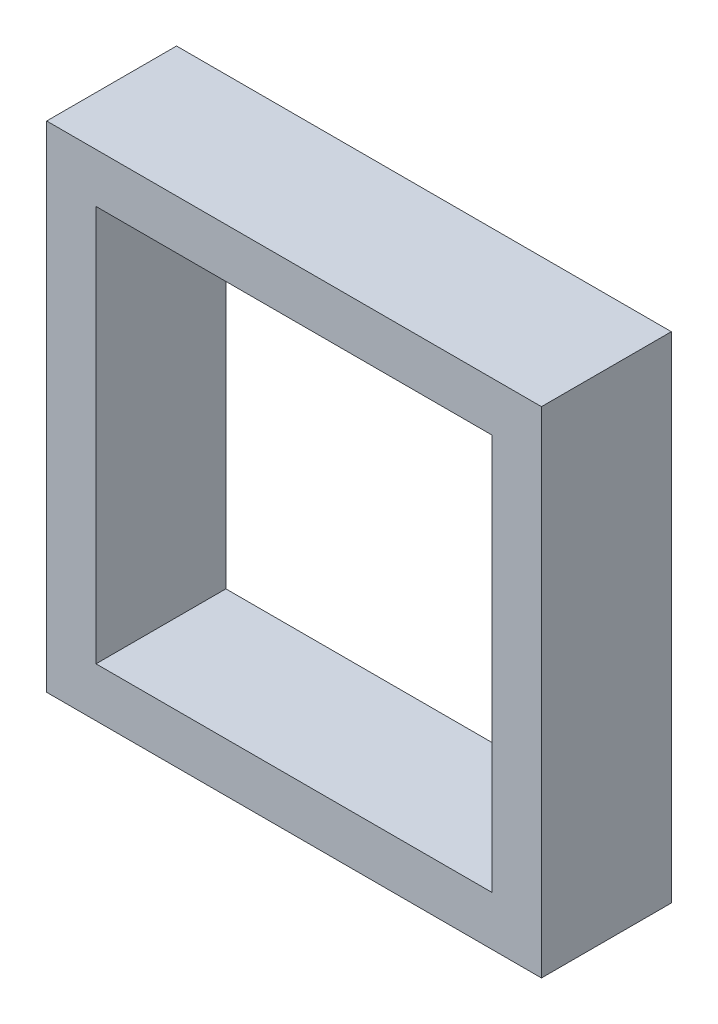
ISO-10303-21;
HEADER;
FILE_DESCRIPTION(('STEP AP214'),'2;1');
FILE_NAME('part.step','',(''),(''),'','','');
FILE_SCHEMA(('AUTOMOTIVE_DESIGN { 1 0 10303 214 1 1 1 1 }'));
ENDSEC;
DATA;
#1=APPLICATION_CONTEXT('core data for automotive mechanical design processes');
#2=APPLICATION_PROTOCOL_DEFINITION('international standard','automotive_design',2000,#1);
#3=PRODUCT_CONTEXT('',#1,'mechanical');
#4=PRODUCT('Part','Part','',(#3));
#5=PRODUCT_RELATED_PRODUCT_CATEGORY('part','',(#4));
#6=PRODUCT_DEFINITION_FORMATION('','',#4);
#7=PRODUCT_DEFINITION_CONTEXT('part definition',#1,'design');
#8=PRODUCT_DEFINITION('design','',#6,#7);
#9=PRODUCT_DEFINITION_SHAPE('','',#8);
#10=(LENGTH_UNIT() NAMED_UNIT(*) SI_UNIT(.MILLI.,.METRE.));
#11=(NAMED_UNIT(*) PLANE_ANGLE_UNIT() SI_UNIT($,.RADIAN.));
#12=(NAMED_UNIT(*) SI_UNIT($,.STERADIAN.) SOLID_ANGLE_UNIT());
#13=UNCERTAINTY_MEASURE_WITH_UNIT(LENGTH_MEASURE(1.E-05),#10,'distance_accuracy_value','');
#14=(GEOMETRIC_REPRESENTATION_CONTEXT(3) GLOBAL_UNCERTAINTY_ASSIGNED_CONTEXT((#13)) GLOBAL_UNIT_ASSIGNED_CONTEXT((#10,
#11,#12)) REPRESENTATION_CONTEXT('',''));
#15=CARTESIAN_POINT('',(0.,0.,0.));
#16=DIRECTION('',(0.,0.,1.));
#17=DIRECTION('',(1.,0.,0.));
#18=AXIS2_PLACEMENT_3D('',#15,#16,#17);
#19=CARTESIAN_POINT('',(0.,0.,10.));
#20=DIRECTION('',(0.,0.,-1.));
#21=DIRECTION('',(-1.,0.,0.));
#22=AXIS2_PLACEMENT_3D('',#19,#20,#21);
#23=PLANE('',#22);
#24=DIRECTION('',(0.,1.,0.));
#25=VECTOR('',#24,1.);
#26=CARTESIAN_POINT('',(19.05,-19.05,10.));
#27=LINE('',#26,#25);
#28=CARTESIAN_POINT('',(19.05,-19.05,10.));
#29=VERTEX_POINT('',#28);
#30=CARTESIAN_POINT('',(19.05,19.05,10.));
#31=VERTEX_POINT('',#30);
#32=EDGE_CURVE('E138',#29,#31,#27,.T.);
#33=ORIENTED_EDGE('',*,*,#32,.T.);
#34=DIRECTION('',(-1.,0.,0.));
#35=VECTOR('',#34,1.);
#36=CARTESIAN_POINT('',(-19.05,19.05,10.));
#37=LINE('',#36,#35);
#38=CARTESIAN_POINT('',(-19.05,19.05,10.));
#39=VERTEX_POINT('',#38);
#40=EDGE_CURVE('E141',#31,#39,#37,.T.);
#41=ORIENTED_EDGE('',*,*,#40,.T.);
#42=DIRECTION('',(0.,-1.,0.));
#43=VECTOR('',#42,1.);
#44=CARTESIAN_POINT('',(-19.05,-19.05,10.));
#45=LINE('',#44,#43);
#46=CARTESIAN_POINT('',(-19.05,-19.05,10.));
#47=VERTEX_POINT('',#46);
#48=EDGE_CURVE('E144',#39,#47,#45,.T.);
#49=ORIENTED_EDGE('',*,*,#48,.T.);
#50=DIRECTION('',(1.,0.,0.));
#51=VECTOR('',#50,1.);
#52=CARTESIAN_POINT('',(-19.05,-19.05,10.));
#53=LINE('',#52,#51);
#54=EDGE_CURVE('E146',#47,#29,#53,.T.);
#55=ORIENTED_EDGE('',*,*,#54,.T.);
#56=EDGE_LOOP('',(#33,#41,#49,#55));
#57=FACE_BOUND('',#56,.T.);
#58=DIRECTION('',(0.,1.,0.));
#59=VECTOR('',#58,1.);
#60=CARTESIAN_POINT('',(15.25,-15.25,10.));
#61=LINE('',#60,#59);
#62=CARTESIAN_POINT('',(15.25,-15.25,10.));
#63=VERTEX_POINT('',#62);
#64=CARTESIAN_POINT('',(15.25,15.25,10.));
#65=VERTEX_POINT('',#64);
#66=EDGE_CURVE('E102',#63,#65,#61,.T.);
#67=ORIENTED_EDGE('',*,*,#66,.F.);
#68=DIRECTION('',(1.,0.,0.));
#69=VECTOR('',#68,1.);
#70=CARTESIAN_POINT('',(-15.25,-15.25,10.));
#71=LINE('',#70,#69);
#72=CARTESIAN_POINT('',(-15.25,-15.25,10.));
#73=VERTEX_POINT('',#72);
#74=EDGE_CURVE('E124',#73,#63,#71,.T.);
#75=ORIENTED_EDGE('',*,*,#74,.F.);
#76=DIRECTION('',(0.,-1.,0.));
#77=VECTOR('',#76,1.);
#78=CARTESIAN_POINT('',(-15.25,-15.25,10.));
#79=LINE('',#78,#77);
#80=CARTESIAN_POINT('',(-15.25,15.25,10.));
#81=VERTEX_POINT('',#80);
#82=EDGE_CURVE('E122',#81,#73,#79,.T.);
#83=ORIENTED_EDGE('',*,*,#82,.F.);
#84=DIRECTION('',(-1.,0.,0.));
#85=VECTOR('',#84,1.);
#86=CARTESIAN_POINT('',(-15.25,15.25,10.));
#87=LINE('',#86,#85);
#88=EDGE_CURVE('E110',#65,#81,#87,.T.);
#89=ORIENTED_EDGE('',*,*,#88,.F.);
#90=EDGE_LOOP('',(#67,#75,#83,#89));
#91=FACE_BOUND('',#90,.T.);
#92=ADVANCED_FACE('F37',(#57,#91),#23,.F.);
#93=CARTESIAN_POINT('',(0.,0.,0.));
#94=DIRECTION('',(0.,0.,-1.));
#95=DIRECTION('',(-1.,0.,0.));
#96=AXIS2_PLACEMENT_3D('',#93,#94,#95);
#97=PLANE('',#96);
#98=DIRECTION('',(0.,1.,0.));
#99=VECTOR('',#98,1.);
#100=CARTESIAN_POINT('',(19.05,-19.05,0.));
#101=LINE('',#100,#99);
#102=CARTESIAN_POINT('',(19.05,-19.05,0.));
#103=VERTEX_POINT('',#102);
#104=CARTESIAN_POINT('',(19.05,19.05,0.));
#105=VERTEX_POINT('',#104);
#106=EDGE_CURVE('E118',#103,#105,#101,.T.);
#107=ORIENTED_EDGE('',*,*,#106,.F.);
#108=DIRECTION('',(1.,0.,0.));
#109=VECTOR('',#108,1.);
#110=CARTESIAN_POINT('',(-19.05,-19.05,0.));
#111=LINE('',#110,#109);
#112=CARTESIAN_POINT('',(-19.05,-19.05,0.));
#113=VERTEX_POINT('',#112);
#114=EDGE_CURVE('E142',#113,#103,#111,.T.);
#115=ORIENTED_EDGE('',*,*,#114,.F.);
#116=DIRECTION('',(0.,-1.,0.));
#117=VECTOR('',#116,1.);
#118=CARTESIAN_POINT('',(-19.05,-19.05,0.));
#119=LINE('',#118,#117);
#120=CARTESIAN_POINT('',(-19.05,19.05,0.));
#121=VERTEX_POINT('',#120);
#122=EDGE_CURVE('E153',#121,#113,#119,.T.);
#123=ORIENTED_EDGE('',*,*,#122,.F.);
#124=DIRECTION('',(-1.,0.,0.));
#125=VECTOR('',#124,1.);
#126=CARTESIAN_POINT('',(-19.05,19.05,0.));
#127=LINE('',#126,#125);
#128=EDGE_CURVE('E151',#105,#121,#127,.T.);
#129=ORIENTED_EDGE('',*,*,#128,.F.);
#130=EDGE_LOOP('',(#107,#115,#123,#129));
#131=FACE_BOUND('',#130,.T.);
#132=DIRECTION('',(1.,0.,0.));
#133=VECTOR('',#132,1.);
#134=CARTESIAN_POINT('',(-15.25,-15.25,0.));
#135=LINE('',#134,#133);
#136=CARTESIAN_POINT('',(-15.25,-15.25,0.));
#137=VERTEX_POINT('',#136);
#138=CARTESIAN_POINT('',(15.25,-15.25,0.));
#139=VERTEX_POINT('',#138);
#140=EDGE_CURVE('E111',#137,#139,#135,.T.);
#141=ORIENTED_EDGE('',*,*,#140,.T.);
#142=DIRECTION('',(0.,1.,0.));
#143=VECTOR('',#142,1.);
#144=CARTESIAN_POINT('',(15.25,-15.25,0.));
#145=LINE('',#144,#143);
#146=CARTESIAN_POINT('',(15.25,15.25,0.));
#147=VERTEX_POINT('',#146);
#148=EDGE_CURVE('E60',#139,#147,#145,.T.);
#149=ORIENTED_EDGE('',*,*,#148,.T.);
#150=DIRECTION('',(-1.,0.,0.));
#151=VECTOR('',#150,1.);
#152=CARTESIAN_POINT('',(-15.25,15.25,0.));
#153=LINE('',#152,#151);
#154=CARTESIAN_POINT('',(-15.25,15.25,0.));
#155=VERTEX_POINT('',#154);
#156=EDGE_CURVE('E117',#147,#155,#153,.T.);
#157=ORIENTED_EDGE('',*,*,#156,.T.);
#158=DIRECTION('',(0.,-1.,0.));
#159=VECTOR('',#158,1.);
#160=CARTESIAN_POINT('',(-15.25,-15.25,0.));
#161=LINE('',#160,#159);
#162=EDGE_CURVE('E130',#155,#137,#161,.T.);
#163=ORIENTED_EDGE('',*,*,#162,.T.);
#164=EDGE_LOOP('',(#141,#149,#157,#163));
#165=FACE_BOUND('',#164,.T.);
#166=ADVANCED_FACE('F171',(#131,#165),#97,.T.);
#167=CARTESIAN_POINT('',(19.05,-19.05,10.));
#168=DIRECTION('',(-1.,0.,0.));
#169=DIRECTION('',(0.,0.,1.));
#170=AXIS2_PLACEMENT_3D('',#167,#168,#169);
#171=PLANE('',#170);
#172=ORIENTED_EDGE('',*,*,#106,.T.);
#173=DIRECTION('',(0.,0.,-1.));
#174=VECTOR('',#173,1.);
#175=CARTESIAN_POINT('',(19.05,19.05,10.));
#176=LINE('',#175,#174);
#177=EDGE_CURVE('E11',#31,#105,#176,.T.);
#178=ORIENTED_EDGE('',*,*,#177,.F.);
#179=ORIENTED_EDGE('',*,*,#32,.F.);
#180=DIRECTION('',(0.,0.,-1.));
#181=VECTOR('',#180,1.);
#182=CARTESIAN_POINT('',(19.05,-19.05,10.));
#183=LINE('',#182,#181);
#184=EDGE_CURVE('E148',#29,#103,#183,.T.);
#185=ORIENTED_EDGE('',*,*,#184,.T.);
#186=EDGE_LOOP('',(#172,#178,#179,#185));
#187=FACE_BOUND('',#186,.T.);
#188=ADVANCED_FACE('F39',(#187),#171,.F.);
#189=CARTESIAN_POINT('',(-19.05,19.05,10.));
#190=DIRECTION('',(0.,-1.,0.));
#191=DIRECTION('',(0.,0.,-1.));
#192=AXIS2_PLACEMENT_3D('',#189,#190,#191);
#193=PLANE('',#192);
#194=ORIENTED_EDGE('',*,*,#128,.T.);
#195=DIRECTION('',(0.,0.,-1.));
#196=VECTOR('',#195,1.);
#197=CARTESIAN_POINT('',(-19.05,19.05,10.));
#198=LINE('',#197,#196);
#199=EDGE_CURVE('E45',#39,#121,#198,.T.);
#200=ORIENTED_EDGE('',*,*,#199,.F.);
#201=ORIENTED_EDGE('',*,*,#40,.F.);
#202=ORIENTED_EDGE('',*,*,#177,.T.);
#203=EDGE_LOOP('',(#194,#200,#201,#202));
#204=FACE_BOUND('',#203,.T.);
#205=ADVANCED_FACE('F181',(#204),#193,.F.);
#206=CARTESIAN_POINT('',(-19.05,-19.05,10.));
#207=DIRECTION('',(1.,0.,0.));
#208=DIRECTION('',(0.,0.,-1.));
#209=AXIS2_PLACEMENT_3D('',#206,#207,#208);
#210=PLANE('',#209);
#211=ORIENTED_EDGE('',*,*,#122,.T.);
#212=DIRECTION('',(0.,0.,-1.));
#213=VECTOR('',#212,1.);
#214=CARTESIAN_POINT('',(-19.05,-19.05,10.));
#215=LINE('',#214,#213);
#216=EDGE_CURVE('E158',#47,#113,#215,.T.);
#217=ORIENTED_EDGE('',*,*,#216,.F.);
#218=ORIENTED_EDGE('',*,*,#48,.F.);
#219=ORIENTED_EDGE('',*,*,#199,.T.);
#220=EDGE_LOOP('',(#211,#217,#218,#219));
#221=FACE_BOUND('',#220,.T.);
#222=ADVANCED_FACE('F165',(#221),#210,.F.);
#223=CARTESIAN_POINT('',(-19.05,-19.05,10.));
#224=DIRECTION('',(0.,1.,0.));
#225=DIRECTION('',(0.,0.,1.));
#226=AXIS2_PLACEMENT_3D('',#223,#224,#225);
#227=PLANE('',#226);
#228=ORIENTED_EDGE('',*,*,#114,.T.);
#229=ORIENTED_EDGE('',*,*,#184,.F.);
#230=ORIENTED_EDGE('',*,*,#54,.F.);
#231=ORIENTED_EDGE('',*,*,#216,.T.);
#232=EDGE_LOOP('',(#228,#229,#230,#231));
#233=FACE_BOUND('',#232,.T.);
#234=ADVANCED_FACE('F175',(#233),#227,.F.);
#235=CARTESIAN_POINT('',(15.25,-15.25,10.));
#236=DIRECTION('',(-1.,0.,0.));
#237=DIRECTION('',(0.,0.,1.));
#238=AXIS2_PLACEMENT_3D('',#235,#236,#237);
#239=PLANE('',#238);
#240=ORIENTED_EDGE('',*,*,#148,.F.);
#241=DIRECTION('',(0.,0.,-1.));
#242=VECTOR('',#241,1.);
#243=CARTESIAN_POINT('',(15.25,-15.25,10.));
#244=LINE('',#243,#242);
#245=EDGE_CURVE('E106',#63,#139,#244,.T.);
#246=ORIENTED_EDGE('',*,*,#245,.F.);
#247=ORIENTED_EDGE('',*,*,#66,.T.);
#248=DIRECTION('',(0.,0.,-1.));
#249=VECTOR('',#248,1.);
#250=CARTESIAN_POINT('',(15.25,15.25,10.));
#251=LINE('',#250,#249);
#252=EDGE_CURVE('E105',#65,#147,#251,.T.);
#253=ORIENTED_EDGE('',*,*,#252,.T.);
#254=EDGE_LOOP('',(#240,#246,#247,#253));
#255=FACE_BOUND('',#254,.T.);
#256=ADVANCED_FACE('F104',(#255),#239,.T.);
#257=CARTESIAN_POINT('',(-15.25,15.25,10.));
#258=DIRECTION('',(0.,-1.,0.));
#259=DIRECTION('',(0.,0.,-1.));
#260=AXIS2_PLACEMENT_3D('',#257,#258,#259);
#261=PLANE('',#260);
#262=ORIENTED_EDGE('',*,*,#156,.F.);
#263=ORIENTED_EDGE('',*,*,#252,.F.);
#264=ORIENTED_EDGE('',*,*,#88,.T.);
#265=DIRECTION('',(0.,0.,-1.));
#266=VECTOR('',#265,1.);
#267=CARTESIAN_POINT('',(-15.25,15.25,10.));
#268=LINE('',#267,#266);
#269=EDGE_CURVE('E119',#81,#155,#268,.T.);
#270=ORIENTED_EDGE('',*,*,#269,.T.);
#271=EDGE_LOOP('',(#262,#263,#264,#270));
#272=FACE_BOUND('',#271,.T.);
#273=ADVANCED_FACE('F114',(#272),#261,.T.);
#274=CARTESIAN_POINT('',(-15.25,-15.25,10.));
#275=DIRECTION('',(1.,0.,0.));
#276=DIRECTION('',(0.,0.,-1.));
#277=AXIS2_PLACEMENT_3D('',#274,#275,#276);
#278=PLANE('',#277);
#279=ORIENTED_EDGE('',*,*,#162,.F.);
#280=ORIENTED_EDGE('',*,*,#269,.F.);
#281=ORIENTED_EDGE('',*,*,#82,.T.);
#282=DIRECTION('',(0.,0.,-1.));
#283=VECTOR('',#282,1.);
#284=CARTESIAN_POINT('',(-15.25,-15.25,10.));
#285=LINE('',#284,#283);
#286=EDGE_CURVE('E52',#73,#137,#285,.T.);
#287=ORIENTED_EDGE('',*,*,#286,.T.);
#288=EDGE_LOOP('',(#279,#280,#281,#287));
#289=FACE_BOUND('',#288,.T.);
#290=ADVANCED_FACE('F204',(#289),#278,.T.);
#291=CARTESIAN_POINT('',(-15.25,-15.25,10.));
#292=DIRECTION('',(0.,1.,0.));
#293=DIRECTION('',(0.,0.,1.));
#294=AXIS2_PLACEMENT_3D('',#291,#292,#293);
#295=PLANE('',#294);
#296=ORIENTED_EDGE('',*,*,#140,.F.);
#297=ORIENTED_EDGE('',*,*,#286,.F.);
#298=ORIENTED_EDGE('',*,*,#74,.T.);
#299=ORIENTED_EDGE('',*,*,#245,.T.);
#300=EDGE_LOOP('',(#296,#297,#298,#299));
#301=FACE_BOUND('',#300,.T.);
#302=ADVANCED_FACE('F208',(#301),#295,.T.);
#303=CLOSED_SHELL('',(#92,#166,#188,#205,#222,#234,#256,#273,#290,#302));
#304=MANIFOLD_SOLID_BREP('B2',#303);
#305=ADVANCED_BREP_SHAPE_REPRESENTATION('',(#18,#304),#14);
#306=SHAPE_DEFINITION_REPRESENTATION(#9,#305);
ENDSEC;
END-ISO-10303-21;
